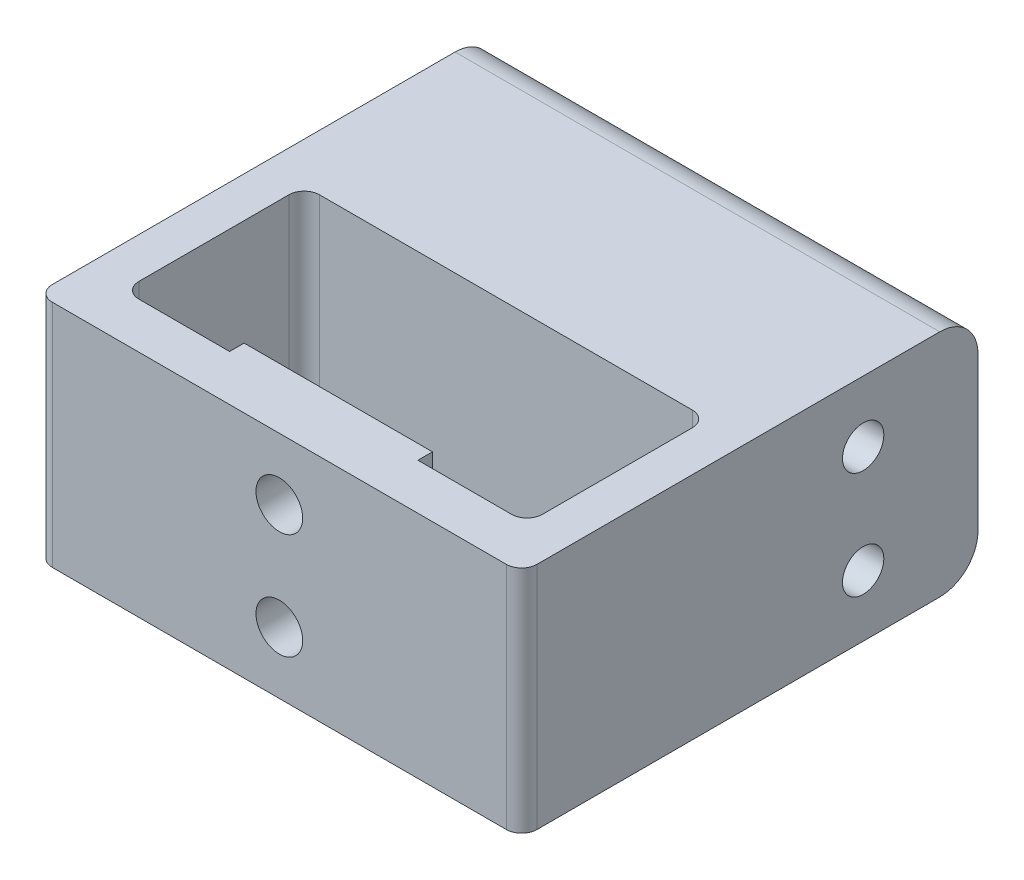
ISO-10303-21;
HEADER;
FILE_DESCRIPTION(('STEP AP214'),'2;1');
FILE_NAME('part.step','',(''),(''),'','','');
FILE_SCHEMA(('AUTOMOTIVE_DESIGN { 1 0 10303 214 1 1 1 1 }'));
ENDSEC;
DATA;
#1=APPLICATION_CONTEXT('core data for automotive mechanical design processes');
#2=APPLICATION_PROTOCOL_DEFINITION('international standard','automotive_design',2000,#1);
#3=PRODUCT_CONTEXT('',#1,'mechanical');
#4=PRODUCT('Part','Part','',(#3));
#5=PRODUCT_RELATED_PRODUCT_CATEGORY('part','',(#4));
#6=PRODUCT_DEFINITION_FORMATION('','',#4);
#7=PRODUCT_DEFINITION_CONTEXT('part definition',#1,'design');
#8=PRODUCT_DEFINITION('design','',#6,#7);
#9=PRODUCT_DEFINITION_SHAPE('','',#8);
#10=(LENGTH_UNIT() NAMED_UNIT(*) SI_UNIT(.MILLI.,.METRE.));
#11=(NAMED_UNIT(*) PLANE_ANGLE_UNIT() SI_UNIT($,.RADIAN.));
#12=(NAMED_UNIT(*) SI_UNIT($,.STERADIAN.) SOLID_ANGLE_UNIT());
#13=UNCERTAINTY_MEASURE_WITH_UNIT(LENGTH_MEASURE(1.E-05),#10,'distance_accuracy_value','');
#14=(GEOMETRIC_REPRESENTATION_CONTEXT(3) GLOBAL_UNCERTAINTY_ASSIGNED_CONTEXT((#13)) GLOBAL_UNIT_ASSIGNED_CONTEXT((#10,
#11,#12)) REPRESENTATION_CONTEXT('',''));
#15=CARTESIAN_POINT('',(0.,0.,0.));
#16=DIRECTION('',(0.,0.,1.));
#17=DIRECTION('',(1.,0.,0.));
#18=AXIS2_PLACEMENT_3D('',#15,#16,#17);
#19=CARTESIAN_POINT('',(-12.5,13.8449367088608,1.9));
#20=DIRECTION('',(1.,0.,0.));
#21=DIRECTION('',(0.,1.,0.));
#22=AXIS2_PLACEMENT_3D('',#19,#20,#21);
#23=PLANE('',#22);
#24=DIRECTION('',(0.,-1.,0.));
#25=VECTOR('',#24,1.);
#26=CARTESIAN_POINT('',(-12.5,13.8449367088608,0.));
#27=LINE('',#26,#25);
#28=CARTESIAN_POINT('',(-12.5,13.8449367088608,0.));
#29=VERTEX_POINT('',#28);
#30=CARTESIAN_POINT('',(-12.5,-16.1550632911392,0.));
#31=VERTEX_POINT('',#30);
#32=EDGE_CURVE('E222',#29,#31,#27,.T.);
#33=ORIENTED_EDGE('',*,*,#32,.T.);
#34=DIRECTION('',(0.,0.,-1.));
#35=VECTOR('',#34,1.);
#36=CARTESIAN_POINT('',(-12.5,-16.1550632911392,1.9));
#37=LINE('',#36,#35);
#38=CARTESIAN_POINT('',(-12.5,-16.1550632911392,1.9));
#39=VERTEX_POINT('',#38);
#40=EDGE_CURVE('E236',#39,#31,#37,.T.);
#41=ORIENTED_EDGE('',*,*,#40,.F.);
#42=DIRECTION('',(0.,-1.,0.));
#43=VECTOR('',#42,1.);
#44=CARTESIAN_POINT('',(-12.5,13.8449367088608,1.9));
#45=LINE('',#44,#43);
#46=CARTESIAN_POINT('',(-12.5,13.8449367088608,1.9));
#47=VERTEX_POINT('',#46);
#48=EDGE_CURVE('E212',#47,#39,#45,.T.);
#49=ORIENTED_EDGE('',*,*,#48,.F.);
#50=DIRECTION('',(0.,0.,-1.));
#51=VECTOR('',#50,1.);
#52=CARTESIAN_POINT('',(-12.5,13.8449367088608,1.9));
#53=LINE('',#52,#51);
#54=EDGE_CURVE('E206',#47,#29,#53,.T.);
#55=ORIENTED_EDGE('',*,*,#54,.T.);
#56=EDGE_LOOP('',(#33,#41,#49,#55));
#57=FACE_BOUND('',#56,.T.);
#58=ADVANCED_FACE('F39',(#57),#23,.F.);
#59=CARTESIAN_POINT('',(-12.5,-16.1550632911392,1.9));
#60=DIRECTION('',(0.,1.,0.));
#61=DIRECTION('',(0.,0.,1.));
#62=AXIS2_PLACEMENT_3D('',#59,#60,#61);
#63=PLANE('',#62);
#64=DIRECTION('',(0.,0.,-1.));
#65=VECTOR('',#64,1.);
#66=CARTESIAN_POINT('',(26.35,-16.1550632911393,7.9));
#67=LINE('',#66,#65);
#68=CARTESIAN_POINT('',(26.35,-16.1550632911393,-0.0999999999999994));
#69=VERTEX_POINT('',#68);
#70=CARTESIAN_POINT('',(26.35,-16.1550632911393,-19.7));
#71=VERTEX_POINT('',#70);
#72=EDGE_CURVE('E388',#69,#71,#67,.T.);
#73=ORIENTED_EDGE('',*,*,#72,.T.);
#74=CARTESIAN_POINT('',(24.35,-16.1550632911392,-19.7));
#75=DIRECTION('',(0.,1.,0.));
#76=DIRECTION('',(0.,0.,1.));
#77=AXIS2_PLACEMENT_3D('',#74,#75,#76);
#78=CIRCLE('',#77,2.);
#79=CARTESIAN_POINT('',(24.35,-16.1550632911393,-21.7));
#80=VERTEX_POINT('',#79);
#81=EDGE_CURVE('E316',#71,#80,#78,.T.);
#82=ORIENTED_EDGE('',*,*,#81,.T.);
#83=DIRECTION('',(-1.,0.,0.));
#84=VECTOR('',#83,1.);
#85=CARTESIAN_POINT('',(31.65,-16.1550632911393,-21.7));
#86=LINE('',#85,#84);
#87=CARTESIAN_POINT('',(-24.35,-16.1550632911393,-21.7));
#88=VERTEX_POINT('',#87);
#89=EDGE_CURVE('E380',#80,#88,#86,.T.);
#90=ORIENTED_EDGE('',*,*,#89,.T.);
#91=CARTESIAN_POINT('',(-24.35,-16.1550632911392,-19.7));
#92=DIRECTION('',(0.,1.,0.));
#93=DIRECTION('',(0.,0.,1.));
#94=AXIS2_PLACEMENT_3D('',#91,#92,#93);
#95=CIRCLE('',#94,2.);
#96=CARTESIAN_POINT('',(-26.35,-16.1550632911393,-19.7));
#97=VERTEX_POINT('',#96);
#98=EDGE_CURVE('E302',#88,#97,#95,.T.);
#99=ORIENTED_EDGE('',*,*,#98,.T.);
#100=DIRECTION('',(0.,0.,1.));
#101=VECTOR('',#100,1.);
#102=CARTESIAN_POINT('',(-26.35,-16.1550632911393,7.9));
#103=LINE('',#102,#101);
#104=CARTESIAN_POINT('',(-26.35,-16.1550632911393,-0.0999999999999994));
#105=VERTEX_POINT('',#104);
#106=EDGE_CURVE('E407',#97,#105,#103,.T.);
#107=ORIENTED_EDGE('',*,*,#106,.T.);
#108=CARTESIAN_POINT('',(-24.35,-16.1550632911392,-0.1));
#109=DIRECTION('',(0.,1.,0.));
#110=DIRECTION('',(0.,0.,1.));
#111=AXIS2_PLACEMENT_3D('',#108,#109,#110);
#112=CIRCLE('',#111,2.);
#113=CARTESIAN_POINT('',(-24.35,-16.1550632911393,1.9));
#114=VERTEX_POINT('',#113);
#115=EDGE_CURVE('E296',#105,#114,#112,.T.);
#116=ORIENTED_EDGE('',*,*,#115,.T.);
#117=DIRECTION('',(1.,0.,0.));
#118=VECTOR('',#117,1.);
#119=CARTESIAN_POINT('',(-26.35,-16.1550632911393,1.9));
#120=LINE('',#119,#118);
#121=EDGE_CURVE('E422',#114,#39,#120,.T.);
#122=ORIENTED_EDGE('',*,*,#121,.T.);
#123=ORIENTED_EDGE('',*,*,#40,.T.);
#124=DIRECTION('',(1.,0.,0.));
#125=VECTOR('',#124,1.);
#126=CARTESIAN_POINT('',(-12.5,-16.1550632911392,0.));
#127=LINE('',#126,#125);
#128=CARTESIAN_POINT('',(12.1,-16.1550632911392,0.));
#129=VERTEX_POINT('',#128);
#130=EDGE_CURVE('E226',#31,#129,#127,.T.);
#131=ORIENTED_EDGE('',*,*,#130,.T.);
#132=DIRECTION('',(0.,0.,-1.));
#133=VECTOR('',#132,1.);
#134=CARTESIAN_POINT('',(12.1,-16.1550632911392,1.9));
#135=LINE('',#134,#133);
#136=CARTESIAN_POINT('',(12.1,-16.1550632911392,1.9));
#137=VERTEX_POINT('',#136);
#138=EDGE_CURVE('E205',#137,#129,#135,.T.);
#139=ORIENTED_EDGE('',*,*,#138,.F.);
#140=CARTESIAN_POINT('',(24.35,-16.1550632911393,1.9));
#141=VERTEX_POINT('',#140);
#142=EDGE_CURVE('E210',#137,#141,#120,.T.);
#143=ORIENTED_EDGE('',*,*,#142,.T.);
#144=CARTESIAN_POINT('',(24.35,-16.1550632911392,-0.1));
#145=DIRECTION('',(0.,1.,0.));
#146=DIRECTION('',(0.,0.,1.));
#147=AXIS2_PLACEMENT_3D('',#144,#145,#146);
#148=CIRCLE('',#147,2.);
#149=EDGE_CURVE('E310',#141,#69,#148,.T.);
#150=ORIENTED_EDGE('',*,*,#149,.T.);
#151=EDGE_LOOP('',(#73,#82,#90,#99,#107,#116,#122,#123,#131,#139,#143,#150));
#152=FACE_BOUND('',#151,.T.);
#153=DIRECTION('',(0.,0.,1.));
#154=VECTOR('',#153,1.);
#155=CARTESIAN_POINT('',(-31.65,-16.1550632911393,7.9));
#156=LINE('',#155,#154);
#157=CARTESIAN_POINT('',(-31.65,-16.1550632911393,-46.7));
#158=VERTEX_POINT('',#157);
#159=CARTESIAN_POINT('',(-31.65,-16.1550632911393,5.9));
#160=VERTEX_POINT('',#159);
#161=EDGE_CURVE('E406',#158,#160,#156,.T.);
#162=ORIENTED_EDGE('',*,*,#161,.F.);
#163=DIRECTION('',(-1.,0.,0.));
#164=VECTOR('',#163,1.);
#165=CARTESIAN_POINT('',(31.65,-16.1550632911392,-46.7));
#166=LINE('',#165,#164);
#167=CARTESIAN_POINT('',(31.65,-16.1550632911393,-46.7));
#168=VERTEX_POINT('',#167);
#169=EDGE_CURVE('E65',#158,#168,#166,.F.);
#170=ORIENTED_EDGE('',*,*,#169,.T.);
#171=DIRECTION('',(0.,0.,-1.));
#172=VECTOR('',#171,1.);
#173=CARTESIAN_POINT('',(31.65,-16.1550632911393,7.9));
#174=LINE('',#173,#172);
#175=CARTESIAN_POINT('',(31.65,-16.1550632911393,5.9));
#176=VERTEX_POINT('',#175);
#177=EDGE_CURVE('E389',#176,#168,#174,.T.);
#178=ORIENTED_EDGE('',*,*,#177,.F.);
#179=CARTESIAN_POINT('',(29.65,-16.1550632911392,5.9));
#180=DIRECTION('',(0.,1.,0.));
#181=DIRECTION('',(0.,0.,1.));
#182=AXIS2_PLACEMENT_3D('',#179,#180,#181);
#183=CIRCLE('',#182,2.);
#184=CARTESIAN_POINT('',(29.65,-16.1550632911393,7.9));
#185=VERTEX_POINT('',#184);
#186=EDGE_CURVE('E257',#176,#185,#183,.F.);
#187=ORIENTED_EDGE('',*,*,#186,.T.);
#188=DIRECTION('',(1.,0.,0.));
#189=VECTOR('',#188,1.);
#190=CARTESIAN_POINT('',(-26.35,-16.1550632911393,7.9));
#191=LINE('',#190,#189);
#192=CARTESIAN_POINT('',(-29.65,-16.1550632911393,7.9));
#193=VERTEX_POINT('',#192);
#194=EDGE_CURVE('E193',#193,#185,#191,.T.);
#195=ORIENTED_EDGE('',*,*,#194,.F.);
#196=CARTESIAN_POINT('',(-29.65,-16.1550632911392,5.9));
#197=DIRECTION('',(0.,1.,0.));
#198=DIRECTION('',(0.,0.,1.));
#199=AXIS2_PLACEMENT_3D('',#196,#197,#198);
#200=CIRCLE('',#199,2.);
#201=EDGE_CURVE('E260',#193,#160,#200,.F.);
#202=ORIENTED_EDGE('',*,*,#201,.T.);
#203=EDGE_LOOP('',(#162,#170,#178,#187,#195,#202));
#204=FACE_BOUND('',#203,.T.);
#205=ADVANCED_FACE('F430',(#152,#204),#63,.F.);
#206=CARTESIAN_POINT('',(12.1,13.8449367088608,1.9));
#207=DIRECTION('',(-1.,0.,0.));
#208=DIRECTION('',(0.,-1.,0.));
#209=AXIS2_PLACEMENT_3D('',#206,#207,#208);
#210=PLANE('',#209);
#211=DIRECTION('',(0.,1.,0.));
#212=VECTOR('',#211,1.);
#213=CARTESIAN_POINT('',(12.1,13.8449367088608,0.));
#214=LINE('',#213,#212);
#215=CARTESIAN_POINT('',(12.1,13.8449367088608,0.));
#216=VERTEX_POINT('',#215);
#217=EDGE_CURVE('E203',#129,#216,#214,.T.);
#218=ORIENTED_EDGE('',*,*,#217,.T.);
#219=DIRECTION('',(0.,0.,-1.));
#220=VECTOR('',#219,1.);
#221=CARTESIAN_POINT('',(12.1,13.8449367088608,1.9));
#222=LINE('',#221,#220);
#223=CARTESIAN_POINT('',(12.1,13.8449367088607,1.9));
#224=VERTEX_POINT('',#223);
#225=EDGE_CURVE('E185',#224,#216,#222,.T.);
#226=ORIENTED_EDGE('',*,*,#225,.F.);
#227=DIRECTION('',(0.,1.,0.));
#228=VECTOR('',#227,1.);
#229=CARTESIAN_POINT('',(12.1,13.8449367088608,1.9));
#230=LINE('',#229,#228);
#231=EDGE_CURVE('E200',#137,#224,#230,.T.);
#232=ORIENTED_EDGE('',*,*,#231,.F.);
#233=ORIENTED_EDGE('',*,*,#138,.T.);
#234=EDGE_LOOP('',(#218,#226,#232,#233));
#235=FACE_BOUND('',#234,.T.);
#236=ADVANCED_FACE('F198',(#235),#210,.F.);
#237=CARTESIAN_POINT('',(-12.5,13.8449367088608,1.9));
#238=DIRECTION('',(0.,-1.,0.));
#239=DIRECTION('',(0.,0.,-1.));
#240=AXIS2_PLACEMENT_3D('',#237,#238,#239);
#241=PLANE('',#240);
#242=DIRECTION('',(-1.,0.,0.));
#243=VECTOR('',#242,1.);
#244=CARTESIAN_POINT('',(-26.35,13.8449367088607,1.9));
#245=LINE('',#244,#243);
#246=CARTESIAN_POINT('',(-24.35,13.8449367088607,1.9));
#247=VERTEX_POINT('',#246);
#248=EDGE_CURVE('E194',#47,#247,#245,.T.);
#249=ORIENTED_EDGE('',*,*,#248,.T.);
#250=CARTESIAN_POINT('',(-24.35,13.8449367088608,-0.1));
#251=DIRECTION('',(0.,-1.,0.));
#252=DIRECTION('',(0.,0.,-1.));
#253=AXIS2_PLACEMENT_3D('',#250,#251,#252);
#254=CIRCLE('',#253,2.);
#255=CARTESIAN_POINT('',(-26.35,13.8449367088607,-0.0999999999999994));
#256=VERTEX_POINT('',#255);
#257=EDGE_CURVE('E299',#247,#256,#254,.T.);
#258=ORIENTED_EDGE('',*,*,#257,.T.);
#259=DIRECTION('',(0.,0.,-1.));
#260=VECTOR('',#259,1.);
#261=CARTESIAN_POINT('',(-26.35,13.8449367088607,7.9));
#262=LINE('',#261,#260);
#263=CARTESIAN_POINT('',(-26.35,13.8449367088607,-19.7));
#264=VERTEX_POINT('',#263);
#265=EDGE_CURVE('E396',#256,#264,#262,.T.);
#266=ORIENTED_EDGE('',*,*,#265,.T.);
#267=CARTESIAN_POINT('',(-24.35,13.8449367088608,-19.7));
#268=DIRECTION('',(0.,-1.,0.));
#269=DIRECTION('',(0.,0.,-1.));
#270=AXIS2_PLACEMENT_3D('',#267,#268,#269);
#271=CIRCLE('',#270,2.);
#272=CARTESIAN_POINT('',(-24.35,13.8449367088608,-21.7));
#273=VERTEX_POINT('',#272);
#274=EDGE_CURVE('E305',#264,#273,#271,.T.);
#275=ORIENTED_EDGE('',*,*,#274,.T.);
#276=DIRECTION('',(1.,0.,0.));
#277=VECTOR('',#276,1.);
#278=CARTESIAN_POINT('',(31.65,13.8449367088608,-21.7));
#279=LINE('',#278,#277);
#280=CARTESIAN_POINT('',(24.35,13.8449367088608,-21.7));
#281=VERTEX_POINT('',#280);
#282=EDGE_CURVE('E384',#273,#281,#279,.T.);
#283=ORIENTED_EDGE('',*,*,#282,.T.);
#284=CARTESIAN_POINT('',(24.35,13.8449367088608,-19.7));
#285=DIRECTION('',(0.,-1.,0.));
#286=DIRECTION('',(0.,0.,-1.));
#287=AXIS2_PLACEMENT_3D('',#284,#285,#286);
#288=CIRCLE('',#287,2.);
#289=CARTESIAN_POINT('',(26.35,13.8449367088607,-19.7));
#290=VERTEX_POINT('',#289);
#291=EDGE_CURVE('E313',#281,#290,#288,.T.);
#292=ORIENTED_EDGE('',*,*,#291,.T.);
#293=DIRECTION('',(0.,0.,1.));
#294=VECTOR('',#293,1.);
#295=CARTESIAN_POINT('',(26.35,13.8449367088607,7.9));
#296=LINE('',#295,#294);
#297=CARTESIAN_POINT('',(26.35,13.8449367088607,-0.0999999999999994));
#298=VERTEX_POINT('',#297);
#299=EDGE_CURVE('E393',#290,#298,#296,.T.);
#300=ORIENTED_EDGE('',*,*,#299,.T.);
#301=CARTESIAN_POINT('',(24.35,13.8449367088608,-0.1));
#302=DIRECTION('',(0.,-1.,0.));
#303=DIRECTION('',(0.,0.,-1.));
#304=AXIS2_PLACEMENT_3D('',#301,#302,#303);
#305=CIRCLE('',#304,2.);
#306=CARTESIAN_POINT('',(24.35,13.8449367088607,1.9));
#307=VERTEX_POINT('',#306);
#308=EDGE_CURVE('E188',#298,#307,#305,.T.);
#309=ORIENTED_EDGE('',*,*,#308,.T.);
#310=EDGE_CURVE('E180',#307,#224,#245,.T.);
#311=ORIENTED_EDGE('',*,*,#310,.T.);
#312=ORIENTED_EDGE('',*,*,#225,.T.);
#313=DIRECTION('',(-1.,0.,0.));
#314=VECTOR('',#313,1.);
#315=CARTESIAN_POINT('',(-12.5,13.8449367088608,0.));
#316=LINE('',#315,#314);
#317=EDGE_CURVE('E219',#216,#29,#316,.T.);
#318=ORIENTED_EDGE('',*,*,#317,.T.);
#319=ORIENTED_EDGE('',*,*,#54,.F.);
#320=EDGE_LOOP('',(#249,#258,#266,#275,#283,#292,#300,#309,#311,#312,#318,#319));
#321=FACE_BOUND('',#320,.T.);
#322=DIRECTION('',(0.,0.,1.));
#323=VECTOR('',#322,1.);
#324=CARTESIAN_POINT('',(31.65,13.8449367088607,7.9));
#325=LINE('',#324,#323);
#326=CARTESIAN_POINT('',(31.65,13.8449367088607,-46.7));
#327=VERTEX_POINT('',#326);
#328=CARTESIAN_POINT('',(31.65,13.8449367088607,5.9));
#329=VERTEX_POINT('',#328);
#330=EDGE_CURVE('E392',#327,#329,#325,.T.);
#331=ORIENTED_EDGE('',*,*,#330,.F.);
#332=DIRECTION('',(1.,0.,0.));
#333=VECTOR('',#332,1.);
#334=CARTESIAN_POINT('',(-31.65,13.8449367088607,-46.7));
#335=LINE('',#334,#333);
#336=CARTESIAN_POINT('',(-31.65,13.8449367088607,-46.7));
#337=VERTEX_POINT('',#336);
#338=EDGE_CURVE('E11',#327,#337,#335,.F.);
#339=ORIENTED_EDGE('',*,*,#338,.T.);
#340=DIRECTION('',(0.,0.,-1.));
#341=VECTOR('',#340,1.);
#342=CARTESIAN_POINT('',(-31.65,13.8449367088607,7.9));
#343=LINE('',#342,#341);
#344=CARTESIAN_POINT('',(-31.65,13.8449367088607,5.9));
#345=VERTEX_POINT('',#344);
#346=EDGE_CURVE('E402',#345,#337,#343,.T.);
#347=ORIENTED_EDGE('',*,*,#346,.F.);
#348=CARTESIAN_POINT('',(-29.65,13.8449367088608,5.9));
#349=DIRECTION('',(0.,-1.,0.));
#350=DIRECTION('',(0.,0.,-1.));
#351=AXIS2_PLACEMENT_3D('',#348,#349,#350);
#352=CIRCLE('',#351,2.);
#353=CARTESIAN_POINT('',(-29.65,13.8449367088607,7.9));
#354=VERTEX_POINT('',#353);
#355=EDGE_CURVE('E248',#345,#354,#352,.F.);
#356=ORIENTED_EDGE('',*,*,#355,.T.);
#357=DIRECTION('',(-1.,0.,0.));
#358=VECTOR('',#357,1.);
#359=CARTESIAN_POINT('',(-26.35,13.8449367088607,7.9));
#360=LINE('',#359,#358);
#361=CARTESIAN_POINT('',(29.65,13.8449367088607,7.9));
#362=VERTEX_POINT('',#361);
#363=EDGE_CURVE('E227',#362,#354,#360,.T.);
#364=ORIENTED_EDGE('',*,*,#363,.F.);
#365=CARTESIAN_POINT('',(29.65,13.8449367088608,5.9));
#366=DIRECTION('',(0.,-1.,0.));
#367=DIRECTION('',(0.,0.,-1.));
#368=AXIS2_PLACEMENT_3D('',#365,#366,#367);
#369=CIRCLE('',#368,2.);
#370=EDGE_CURVE('E244',#362,#329,#369,.F.);
#371=ORIENTED_EDGE('',*,*,#370,.T.);
#372=EDGE_LOOP('',(#331,#339,#347,#356,#364,#371));
#373=FACE_BOUND('',#372,.T.);
#374=ADVANCED_FACE('F183',(#321,#373),#241,.F.);
#375=CARTESIAN_POINT('',(0.,0.,0.));
#376=DIRECTION('',(0.,0.,1.));
#377=DIRECTION('',(1.,0.,0.));
#378=AXIS2_PLACEMENT_3D('',#375,#376,#377);
#379=PLANE('',#378);
#380=CARTESIAN_POINT('',(0.,5.76993670886075,0.));
#381=DIRECTION('',(0.,0.,1.));
#382=DIRECTION('',(1.,0.,0.));
#383=AXIS2_PLACEMENT_3D('',#380,#381,#382);
#384=CIRCLE('',#383,3.05);
#385=CARTESIAN_POINT('',(-3.05,5.76993670886075,0.));
#386=VERTEX_POINT('',#385);
#387=EDGE_CURVE('E344',#386,#386,#384,.T.);
#388=ORIENTED_EDGE('',*,*,#387,.T.);
#389=EDGE_LOOP('',(#388));
#390=FACE_BOUND('',#389,.T.);
#391=CARTESIAN_POINT('',(0.,-8.08006329113925,0.));
#392=DIRECTION('',(0.,0.,1.));
#393=DIRECTION('',(1.,0.,0.));
#394=AXIS2_PLACEMENT_3D('',#391,#392,#393);
#395=CIRCLE('',#394,3.05);
#396=CARTESIAN_POINT('',(-3.05,-8.08006329113925,0.));
#397=VERTEX_POINT('',#396);
#398=EDGE_CURVE('E357',#397,#397,#395,.T.);
#399=ORIENTED_EDGE('',*,*,#398,.T.);
#400=EDGE_LOOP('',(#399));
#401=FACE_BOUND('',#400,.T.);
#402=ORIENTED_EDGE('',*,*,#32,.F.);
#403=ORIENTED_EDGE('',*,*,#317,.F.);
#404=ORIENTED_EDGE('',*,*,#217,.F.);
#405=ORIENTED_EDGE('',*,*,#130,.F.);
#406=EDGE_LOOP('',(#402,#403,#404,#405));
#407=FACE_BOUND('',#406,.T.);
#408=ADVANCED_FACE('F468',(#390,#401,#407),#379,.F.);
#409=CARTESIAN_POINT('',(0.,0.,1.9));
#410=DIRECTION('',(0.,0.,1.));
#411=DIRECTION('',(1.,0.,0.));
#412=AXIS2_PLACEMENT_3D('',#409,#410,#411);
#413=PLANE('',#412);
#414=ORIENTED_EDGE('',*,*,#121,.F.);
#415=DIRECTION('',(0.,-1.,0.));
#416=VECTOR('',#415,1.);
#417=CARTESIAN_POINT('',(-24.35,0.,1.9));
#418=LINE('',#417,#416);
#419=EDGE_CURVE('E275',#114,#247,#418,.F.);
#420=ORIENTED_EDGE('',*,*,#419,.T.);
#421=ORIENTED_EDGE('',*,*,#248,.F.);
#422=ORIENTED_EDGE('',*,*,#48,.T.);
#423=EDGE_LOOP('',(#414,#420,#421,#422));
#424=FACE_BOUND('',#423,.T.);
#425=ADVANCED_FACE('F462',(#424),#413,.F.);
#426=ORIENTED_EDGE('',*,*,#310,.F.);
#427=DIRECTION('',(0.,1.,0.));
#428=VECTOR('',#427,1.);
#429=CARTESIAN_POINT('',(24.35,-16.1550632911393,1.9));
#430=LINE('',#429,#428);
#431=EDGE_CURVE('E293',#307,#141,#430,.F.);
#432=ORIENTED_EDGE('',*,*,#431,.T.);
#433=ORIENTED_EDGE('',*,*,#142,.F.);
#434=ORIENTED_EDGE('',*,*,#231,.T.);
#435=EDGE_LOOP('',(#426,#432,#433,#434));
#436=FACE_BOUND('',#435,.T.);
#437=ADVANCED_FACE('F208',(#436),#413,.F.);
#438=CARTESIAN_POINT('',(0.,0.,7.9));
#439=DIRECTION('',(0.,0.,1.));
#440=DIRECTION('',(1.,0.,0.));
#441=AXIS2_PLACEMENT_3D('',#438,#439,#440);
#442=PLANE('',#441);
#443=CARTESIAN_POINT('',(0.,5.76993670886075,7.9));
#444=DIRECTION('',(0.,0.,1.));
#445=DIRECTION('',(1.,0.,0.));
#446=AXIS2_PLACEMENT_3D('',#443,#444,#445);
#447=CIRCLE('',#446,3.05);
#448=CARTESIAN_POINT('',(-3.05,5.76993670886075,7.9));
#449=VERTEX_POINT('',#448);
#450=EDGE_CURVE('E343',#449,#449,#447,.F.);
#451=ORIENTED_EDGE('',*,*,#450,.T.);
#452=EDGE_LOOP('',(#451));
#453=FACE_BOUND('',#452,.T.);
#454=CARTESIAN_POINT('',(0.,-8.08006329113925,7.9));
#455=DIRECTION('',(0.,0.,1.));
#456=DIRECTION('',(1.,0.,0.));
#457=AXIS2_PLACEMENT_3D('',#454,#455,#456);
#458=CIRCLE('',#457,3.05);
#459=CARTESIAN_POINT('',(-3.05,-8.08006329113925,7.9));
#460=VERTEX_POINT('',#459);
#461=EDGE_CURVE('E339',#460,#460,#458,.F.);
#462=ORIENTED_EDGE('',*,*,#461,.T.);
#463=EDGE_LOOP('',(#462));
#464=FACE_BOUND('',#463,.T.);
#465=ORIENTED_EDGE('',*,*,#363,.T.);
#466=DIRECTION('',(0.,1.,0.));
#467=VECTOR('',#466,1.);
#468=CARTESIAN_POINT('',(-29.65,-16.1550632911393,7.9));
#469=LINE('',#468,#467);
#470=EDGE_CURVE('E254',#354,#193,#469,.F.);
#471=ORIENTED_EDGE('',*,*,#470,.T.);
#472=ORIENTED_EDGE('',*,*,#194,.T.);
#473=DIRECTION('',(0.,-1.,0.));
#474=VECTOR('',#473,1.);
#475=CARTESIAN_POINT('',(29.65,0.,7.9));
#476=LINE('',#475,#474);
#477=EDGE_CURVE('E251',#185,#362,#476,.F.);
#478=ORIENTED_EDGE('',*,*,#477,.T.);
#479=EDGE_LOOP('',(#465,#471,#472,#478));
#480=FACE_BOUND('',#479,.T.);
#481=ADVANCED_FACE('F530',(#453,#464,#480),#442,.T.);
#482=CARTESIAN_POINT('',(-31.65,0.,0.));
#483=DIRECTION('',(1.,0.,0.));
#484=DIRECTION('',(0.,1.,0.));
#485=AXIS2_PLACEMENT_3D('',#482,#483,#484);
#486=PLANE('',#485);
#487=CARTESIAN_POINT('',(-31.65,5.84493670886075,-36.7));
#488=DIRECTION('',(-1.,0.,0.));
#489=DIRECTION('',(0.,-1.,0.));
#490=AXIS2_PLACEMENT_3D('',#487,#488,#489);
#491=CIRCLE('',#490,2.70000000000001);
#492=CARTESIAN_POINT('',(-31.65,3.14493670886074,-36.7));
#493=VERTEX_POINT('',#492);
#494=EDGE_CURVE('E351',#493,#493,#491,.T.);
#495=ORIENTED_EDGE('',*,*,#494,.F.);
#496=EDGE_LOOP('',(#495));
#497=FACE_BOUND('',#496,.T.);
#498=CARTESIAN_POINT('',(-31.65,-8.15506329113927,-36.7));
#499=DIRECTION('',(-1.,0.,0.));
#500=DIRECTION('',(0.,-1.,0.));
#501=AXIS2_PLACEMENT_3D('',#498,#499,#500);
#502=CIRCLE('',#501,2.70000000000001);
#503=CARTESIAN_POINT('',(-31.65,-10.8550632911393,-36.7));
#504=VERTEX_POINT('',#503);
#505=EDGE_CURVE('E359',#504,#504,#502,.T.);
#506=ORIENTED_EDGE('',*,*,#505,.F.);
#507=EDGE_LOOP('',(#506));
#508=FACE_BOUND('',#507,.T.);
#509=DIRECTION('',(0.,1.,0.));
#510=VECTOR('',#509,1.);
#511=CARTESIAN_POINT('',(-31.65,13.8449367088607,-51.7));
#512=LINE('',#511,#510);
#513=CARTESIAN_POINT('',(-31.65,-11.1550632911393,-51.7));
#514=VERTEX_POINT('',#513);
#515=CARTESIAN_POINT('',(-31.65,8.84493670886075,-51.7));
#516=VERTEX_POINT('',#515);
#517=EDGE_CURVE('E376',#514,#516,#512,.T.);
#518=ORIENTED_EDGE('',*,*,#517,.F.);
#519=CARTESIAN_POINT('',(-31.65,-11.1550632911393,-46.7));
#520=DIRECTION('',(1.,0.,0.));
#521=DIRECTION('',(0.,1.,0.));
#522=AXIS2_PLACEMENT_3D('',#519,#520,#521);
#523=CIRCLE('',#522,5.);
#524=EDGE_CURVE('E330',#514,#158,#523,.F.);
#525=ORIENTED_EDGE('',*,*,#524,.T.);
#526=ORIENTED_EDGE('',*,*,#161,.T.);
#527=DIRECTION('',(0.,1.,0.));
#528=VECTOR('',#527,1.);
#529=CARTESIAN_POINT('',(-31.65,13.8449367088607,5.9));
#530=LINE('',#529,#528);
#531=EDGE_CURVE('E240',#160,#345,#530,.T.);
#532=ORIENTED_EDGE('',*,*,#531,.T.);
#533=ORIENTED_EDGE('',*,*,#346,.T.);
#534=CARTESIAN_POINT('',(-31.65,8.84493670886075,-46.7));
#535=DIRECTION('',(1.,0.,0.));
#536=DIRECTION('',(0.,1.,0.));
#537=AXIS2_PLACEMENT_3D('',#534,#535,#536);
#538=CIRCLE('',#537,5.);
#539=EDGE_CURVE('E327',#337,#516,#538,.F.);
#540=ORIENTED_EDGE('',*,*,#539,.T.);
#541=EDGE_LOOP('',(#518,#525,#526,#532,#533,#540));
#542=FACE_BOUND('',#541,.T.);
#543=ADVANCED_FACE('F523',(#497,#508,#542),#486,.F.);
#544=CARTESIAN_POINT('',(-26.35,0.,0.));
#545=DIRECTION('',(1.,0.,0.));
#546=DIRECTION('',(0.,1.,0.));
#547=AXIS2_PLACEMENT_3D('',#544,#545,#546);
#548=PLANE('',#547);
#549=ORIENTED_EDGE('',*,*,#265,.F.);
#550=DIRECTION('',(0.,-1.,0.));
#551=VECTOR('',#550,1.);
#552=CARTESIAN_POINT('',(-26.35,0.,-0.1));
#553=LINE('',#552,#551);
#554=EDGE_CURVE('E271',#256,#105,#553,.T.);
#555=ORIENTED_EDGE('',*,*,#554,.T.);
#556=ORIENTED_EDGE('',*,*,#106,.F.);
#557=DIRECTION('',(0.,-1.,0.));
#558=VECTOR('',#557,1.);
#559=CARTESIAN_POINT('',(-26.35,0.,-19.7));
#560=LINE('',#559,#558);
#561=EDGE_CURVE('E268',#97,#264,#560,.F.);
#562=ORIENTED_EDGE('',*,*,#561,.T.);
#563=EDGE_LOOP('',(#549,#555,#556,#562));
#564=FACE_BOUND('',#563,.T.);
#565=ADVANCED_FACE('F453',(#564),#548,.T.);
#566=CARTESIAN_POINT('',(26.35,0.,0.));
#567=DIRECTION('',(1.,0.,0.));
#568=DIRECTION('',(0.,1.,0.));
#569=AXIS2_PLACEMENT_3D('',#566,#567,#568);
#570=PLANE('',#569);
#571=ORIENTED_EDGE('',*,*,#72,.F.);
#572=DIRECTION('',(0.,1.,0.));
#573=VECTOR('',#572,1.);
#574=CARTESIAN_POINT('',(26.35,13.8449367088607,-0.1));
#575=LINE('',#574,#573);
#576=EDGE_CURVE('E289',#69,#298,#575,.T.);
#577=ORIENTED_EDGE('',*,*,#576,.T.);
#578=ORIENTED_EDGE('',*,*,#299,.F.);
#579=DIRECTION('',(0.,1.,0.));
#580=VECTOR('',#579,1.);
#581=CARTESIAN_POINT('',(26.35,-16.1550632911393,-19.7));
#582=LINE('',#581,#580);
#583=EDGE_CURVE('E286',#290,#71,#582,.F.);
#584=ORIENTED_EDGE('',*,*,#583,.T.);
#585=EDGE_LOOP('',(#571,#577,#578,#584));
#586=FACE_BOUND('',#585,.T.);
#587=ADVANCED_FACE('F437',(#586),#570,.F.);
#588=CARTESIAN_POINT('',(31.65,0.,0.));
#589=DIRECTION('',(1.,0.,0.));
#590=DIRECTION('',(0.,1.,0.));
#591=AXIS2_PLACEMENT_3D('',#588,#589,#590);
#592=PLANE('',#591);
#593=CARTESIAN_POINT('',(31.65,5.84493670886075,-36.7));
#594=DIRECTION('',(1.,0.,0.));
#595=DIRECTION('',(0.,1.,0.));
#596=AXIS2_PLACEMENT_3D('',#593,#594,#595);
#597=CIRCLE('',#596,2.70000000000001);
#598=CARTESIAN_POINT('',(31.65,8.54493670886077,-36.7));
#599=VERTEX_POINT('',#598);
#600=EDGE_CURVE('E43',#599,#599,#597,.T.);
#601=ORIENTED_EDGE('',*,*,#600,.F.);
#602=EDGE_LOOP('',(#601));
#603=FACE_BOUND('',#602,.T.);
#604=CARTESIAN_POINT('',(31.65,-8.15506329113926,-36.7));
#605=DIRECTION('',(1.,0.,0.));
#606=DIRECTION('',(0.,1.,0.));
#607=AXIS2_PLACEMENT_3D('',#604,#605,#606);
#608=CIRCLE('',#607,2.70000000000001);
#609=CARTESIAN_POINT('',(31.65,-5.45506329113925,-36.7));
#610=VERTEX_POINT('',#609);
#611=EDGE_CURVE('E348',#610,#610,#608,.T.);
#612=ORIENTED_EDGE('',*,*,#611,.F.);
#613=EDGE_LOOP('',(#612));
#614=FACE_BOUND('',#613,.T.);
#615=ORIENTED_EDGE('',*,*,#177,.T.);
#616=CARTESIAN_POINT('',(31.65,-11.1550632911393,-46.7));
#617=DIRECTION('',(1.,0.,0.));
#618=DIRECTION('',(0.,1.,0.));
#619=AXIS2_PLACEMENT_3D('',#616,#617,#618);
#620=CIRCLE('',#619,5.);
#621=CARTESIAN_POINT('',(31.65,-11.1550632911393,-51.7));
#622=VERTEX_POINT('',#621);
#623=EDGE_CURVE('E49',#168,#622,#620,.T.);
#624=ORIENTED_EDGE('',*,*,#623,.T.);
#625=DIRECTION('',(0.,-1.,0.));
#626=VECTOR('',#625,1.);
#627=CARTESIAN_POINT('',(31.65,13.8449367088607,-51.7));
#628=LINE('',#627,#626);
#629=CARTESIAN_POINT('',(31.65,8.84493670886075,-51.7));
#630=VERTEX_POINT('',#629);
#631=EDGE_CURVE('E347',#630,#622,#628,.T.);
#632=ORIENTED_EDGE('',*,*,#631,.F.);
#633=CARTESIAN_POINT('',(31.65,8.84493670886075,-46.7));
#634=DIRECTION('',(1.,0.,0.));
#635=DIRECTION('',(0.,1.,0.));
#636=AXIS2_PLACEMENT_3D('',#633,#634,#635);
#637=CIRCLE('',#636,5.);
#638=EDGE_CURVE('E57',#630,#327,#637,.T.);
#639=ORIENTED_EDGE('',*,*,#638,.T.);
#640=ORIENTED_EDGE('',*,*,#330,.T.);
#641=DIRECTION('',(0.,-1.,0.));
#642=VECTOR('',#641,1.);
#643=CARTESIAN_POINT('',(31.65,0.,5.9));
#644=LINE('',#643,#642);
#645=EDGE_CURVE('E264',#329,#176,#644,.T.);
#646=ORIENTED_EDGE('',*,*,#645,.T.);
#647=EDGE_LOOP('',(#615,#624,#632,#639,#640,#646));
#648=FACE_BOUND('',#647,.T.);
#649=ADVANCED_FACE('F516',(#603,#614,#648),#592,.T.);
#650=CARTESIAN_POINT('',(0.,0.,-21.7));
#651=DIRECTION('',(0.,0.,-1.));
#652=DIRECTION('',(-1.,0.,0.));
#653=AXIS2_PLACEMENT_3D('',#650,#651,#652);
#654=PLANE('',#653);
#655=ORIENTED_EDGE('',*,*,#282,.F.);
#656=DIRECTION('',(0.,-1.,0.));
#657=VECTOR('',#656,1.);
#658=CARTESIAN_POINT('',(-24.35,0.,-21.7));
#659=LINE('',#658,#657);
#660=EDGE_CURVE('E282',#273,#88,#659,.T.);
#661=ORIENTED_EDGE('',*,*,#660,.T.);
#662=ORIENTED_EDGE('',*,*,#89,.F.);
#663=DIRECTION('',(0.,1.,0.));
#664=VECTOR('',#663,1.);
#665=CARTESIAN_POINT('',(24.35,13.8449367088608,-21.7));
#666=LINE('',#665,#664);
#667=EDGE_CURVE('E278',#80,#281,#666,.T.);
#668=ORIENTED_EDGE('',*,*,#667,.T.);
#669=EDGE_LOOP('',(#655,#661,#662,#668));
#670=FACE_BOUND('',#669,.T.);
#671=ADVANCED_FACE('F446',(#670),#654,.F.);
#672=CARTESIAN_POINT('',(-29.65,0.,5.9));
#673=DIRECTION('',(0.,-1.,0.));
#674=DIRECTION('',(1.,0.,0.));
#675=AXIS2_PLACEMENT_3D('',#672,#673,#674);
#676=CYLINDRICAL_SURFACE('',#675,2.);
#677=ORIENTED_EDGE('',*,*,#201,.F.);
#678=ORIENTED_EDGE('',*,*,#470,.F.);
#679=ORIENTED_EDGE('',*,*,#355,.F.);
#680=ORIENTED_EDGE('',*,*,#531,.F.);
#681=EDGE_LOOP('',(#677,#678,#679,#680));
#682=FACE_BOUND('',#681,.T.);
#683=ADVANCED_FACE('F487',(#682),#676,.T.);
#684=CARTESIAN_POINT('',(29.65,0.,5.9));
#685=DIRECTION('',(0.,-1.,0.));
#686=DIRECTION('',(1.,0.,0.));
#687=AXIS2_PLACEMENT_3D('',#684,#685,#686);
#688=CYLINDRICAL_SURFACE('',#687,2.);
#689=ORIENTED_EDGE('',*,*,#370,.F.);
#690=ORIENTED_EDGE('',*,*,#477,.F.);
#691=ORIENTED_EDGE('',*,*,#186,.F.);
#692=ORIENTED_EDGE('',*,*,#645,.F.);
#693=EDGE_LOOP('',(#689,#690,#691,#692));
#694=FACE_BOUND('',#693,.T.);
#695=ADVANCED_FACE('F490',(#694),#688,.T.);
#696=CARTESIAN_POINT('',(-24.35,0.,-0.1));
#697=DIRECTION('',(0.,-1.,0.));
#698=DIRECTION('',(1.,0.,0.));
#699=AXIS2_PLACEMENT_3D('',#696,#697,#698);
#700=CYLINDRICAL_SURFACE('',#699,2.);
#701=ORIENTED_EDGE('',*,*,#257,.F.);
#702=ORIENTED_EDGE('',*,*,#419,.F.);
#703=ORIENTED_EDGE('',*,*,#115,.F.);
#704=ORIENTED_EDGE('',*,*,#554,.F.);
#705=EDGE_LOOP('',(#701,#702,#703,#704));
#706=FACE_BOUND('',#705,.T.);
#707=ADVANCED_FACE('F459',(#706),#700,.F.);
#708=CARTESIAN_POINT('',(-24.35,0.,-19.7));
#709=DIRECTION('',(0.,-1.,0.));
#710=DIRECTION('',(1.,0.,0.));
#711=AXIS2_PLACEMENT_3D('',#708,#709,#710);
#712=CYLINDRICAL_SURFACE('',#711,2.);
#713=ORIENTED_EDGE('',*,*,#274,.F.);
#714=ORIENTED_EDGE('',*,*,#561,.F.);
#715=ORIENTED_EDGE('',*,*,#98,.F.);
#716=ORIENTED_EDGE('',*,*,#660,.F.);
#717=EDGE_LOOP('',(#713,#714,#715,#716));
#718=FACE_BOUND('',#717,.T.);
#719=ADVANCED_FACE('F456',(#718),#712,.F.);
#720=CARTESIAN_POINT('',(24.35,0.,-0.1));
#721=DIRECTION('',(0.,-1.,0.));
#722=DIRECTION('',(1.,0.,0.));
#723=AXIS2_PLACEMENT_3D('',#720,#721,#722);
#724=CYLINDRICAL_SURFACE('',#723,2.);
#725=ORIENTED_EDGE('',*,*,#149,.F.);
#726=ORIENTED_EDGE('',*,*,#431,.F.);
#727=ORIENTED_EDGE('',*,*,#308,.F.);
#728=ORIENTED_EDGE('',*,*,#576,.F.);
#729=EDGE_LOOP('',(#725,#726,#727,#728));
#730=FACE_BOUND('',#729,.T.);
#731=ADVANCED_FACE('F434',(#730),#724,.F.);
#732=CARTESIAN_POINT('',(24.35,0.,-19.7));
#733=DIRECTION('',(0.,-1.,0.));
#734=DIRECTION('',(1.,0.,0.));
#735=AXIS2_PLACEMENT_3D('',#732,#733,#734);
#736=CYLINDRICAL_SURFACE('',#735,2.);
#737=ORIENTED_EDGE('',*,*,#81,.F.);
#738=ORIENTED_EDGE('',*,*,#583,.F.);
#739=ORIENTED_EDGE('',*,*,#291,.F.);
#740=ORIENTED_EDGE('',*,*,#667,.F.);
#741=EDGE_LOOP('',(#737,#738,#739,#740));
#742=FACE_BOUND('',#741,.T.);
#743=ADVANCED_FACE('F443',(#742),#736,.F.);
#744=CARTESIAN_POINT('',(0.,0.,-51.7));
#745=DIRECTION('',(0.,0.,-1.));
#746=DIRECTION('',(-1.,0.,0.));
#747=AXIS2_PLACEMENT_3D('',#744,#745,#746);
#748=PLANE('',#747);
#749=ORIENTED_EDGE('',*,*,#631,.T.);
#750=DIRECTION('',(-1.,0.,0.));
#751=VECTOR('',#750,1.);
#752=CARTESIAN_POINT('',(-31.65,-11.1550632911393,-51.7));
#753=LINE('',#752,#751);
#754=EDGE_CURVE('E323',#622,#514,#753,.T.);
#755=ORIENTED_EDGE('',*,*,#754,.T.);
#756=ORIENTED_EDGE('',*,*,#517,.T.);
#757=DIRECTION('',(1.,0.,0.));
#758=VECTOR('',#757,1.);
#759=CARTESIAN_POINT('',(31.65,8.84493670886075,-51.7));
#760=LINE('',#759,#758);
#761=EDGE_CURVE('E319',#516,#630,#760,.T.);
#762=ORIENTED_EDGE('',*,*,#761,.T.);
#763=EDGE_LOOP('',(#749,#755,#756,#762));
#764=FACE_BOUND('',#763,.T.);
#765=ADVANCED_FACE('F502',(#764),#748,.T.);
#766=CARTESIAN_POINT('',(0.,-11.1550632911393,-46.7));
#767=DIRECTION('',(1.,0.,0.));
#768=DIRECTION('',(0.,0.,-1.));
#769=AXIS2_PLACEMENT_3D('',#766,#767,#768);
#770=CYLINDRICAL_SURFACE('',#769,5.);
#771=ORIENTED_EDGE('',*,*,#623,.F.);
#772=ORIENTED_EDGE('',*,*,#169,.F.);
#773=ORIENTED_EDGE('',*,*,#524,.F.);
#774=ORIENTED_EDGE('',*,*,#754,.F.);
#775=EDGE_LOOP('',(#771,#772,#773,#774));
#776=FACE_BOUND('',#775,.T.);
#777=ADVANCED_FACE('F503',(#776),#770,.T.);
#778=CARTESIAN_POINT('',(0.,8.84493670886075,-46.7));
#779=DIRECTION('',(-1.,0.,0.));
#780=DIRECTION('',(0.,0.,1.));
#781=AXIS2_PLACEMENT_3D('',#778,#779,#780);
#782=CYLINDRICAL_SURFACE('',#781,5.);
#783=ORIENTED_EDGE('',*,*,#539,.F.);
#784=ORIENTED_EDGE('',*,*,#338,.F.);
#785=ORIENTED_EDGE('',*,*,#638,.F.);
#786=ORIENTED_EDGE('',*,*,#761,.F.);
#787=EDGE_LOOP('',(#783,#784,#785,#786));
#788=FACE_BOUND('',#787,.T.);
#789=ADVANCED_FACE('F41',(#788),#782,.T.);
#790=CARTESIAN_POINT('',(0.,-8.08006329113925,26.));
#791=DIRECTION('',(0.,0.,-1.));
#792=DIRECTION('',(-1.,0.,0.));
#793=AXIS2_PLACEMENT_3D('',#790,#791,#792);
#794=CYLINDRICAL_SURFACE('',#793,3.05);
#795=CARTESIAN_POINT('',(-3.05,-8.08006329113925,7.9));
#796=CARTESIAN_POINT('',(-3.05,-8.08006329113925,7.81770833333333));
#797=CARTESIAN_POINT('',(-3.05,-8.08006329113925,7.73541666666667));
#798=CARTESIAN_POINT('',(-3.05,-8.08006329113925,7.57083333333333));
#799=CARTESIAN_POINT('',(-3.05,-8.08006329113925,7.48854166666667));
#800=CARTESIAN_POINT('',(-3.05,-8.08006329113925,7.32395833333333));
#801=CARTESIAN_POINT('',(-3.05,-8.08006329113925,7.24166666666667));
#802=CARTESIAN_POINT('',(-3.05,-8.08006329113925,7.07708333333333));
#803=CARTESIAN_POINT('',(-3.05,-8.08006329113925,6.99479166666667));
#804=CARTESIAN_POINT('',(-3.05,-8.08006329113925,6.83020833333333));
#805=CARTESIAN_POINT('',(-3.05,-8.08006329113925,6.74791666666667));
#806=CARTESIAN_POINT('',(-3.05,-8.08006329113925,6.58333333333333));
#807=CARTESIAN_POINT('',(-3.05,-8.08006329113925,6.50104166666667));
#808=CARTESIAN_POINT('',(-3.05,-8.08006329113925,6.33645833333333));
#809=CARTESIAN_POINT('',(-3.05,-8.08006329113925,6.25416666666667));
#810=CARTESIAN_POINT('',(-3.05,-8.08006329113925,6.08958333333333));
#811=CARTESIAN_POINT('',(-3.05,-8.08006329113925,6.00729166666667));
#812=CARTESIAN_POINT('',(-3.05,-8.08006329113925,5.84270833333333));
#813=CARTESIAN_POINT('',(-3.05,-8.08006329113925,5.76041666666667));
#814=CARTESIAN_POINT('',(-3.05,-8.08006329113925,5.59583333333333));
#815=CARTESIAN_POINT('',(-3.05,-8.08006329113925,5.51354166666667));
#816=CARTESIAN_POINT('',(-3.05,-8.08006329113925,5.34895833333333));
#817=CARTESIAN_POINT('',(-3.05,-8.08006329113925,5.26666666666666));
#818=CARTESIAN_POINT('',(-3.05,-8.08006329113925,5.10208333333333));
#819=CARTESIAN_POINT('',(-3.05,-8.08006329113925,5.01979166666667));
#820=CARTESIAN_POINT('',(-3.05,-8.08006329113925,4.85520833333333));
#821=CARTESIAN_POINT('',(-3.05,-8.08006329113925,4.77291666666667));
#822=CARTESIAN_POINT('',(-3.05,-8.08006329113925,4.60833333333333));
#823=CARTESIAN_POINT('',(-3.05,-8.08006329113925,4.52604166666667));
#824=CARTESIAN_POINT('',(-3.05,-8.08006329113925,4.36145833333333));
#825=CARTESIAN_POINT('',(-3.05,-8.08006329113925,4.27916666666667));
#826=CARTESIAN_POINT('',(-3.05,-8.08006329113925,4.11458333333333));
#827=CARTESIAN_POINT('',(-3.05,-8.08006329113925,4.03229166666667));
#828=CARTESIAN_POINT('',(-3.05,-8.08006329113925,3.86770833333333));
#829=CARTESIAN_POINT('',(-3.05,-8.08006329113925,3.78541666666666));
#830=CARTESIAN_POINT('',(-3.05,-8.08006329113925,3.62083333333333));
#831=CARTESIAN_POINT('',(-3.05,-8.08006329113925,3.53854166666666));
#832=CARTESIAN_POINT('',(-3.05,-8.08006329113925,3.37395833333333));
#833=CARTESIAN_POINT('',(-3.05,-8.08006329113925,3.29166666666666));
#834=CARTESIAN_POINT('',(-3.05,-8.08006329113925,3.12708333333333));
#835=CARTESIAN_POINT('',(-3.05,-8.08006329113925,3.04479166666666));
#836=CARTESIAN_POINT('',(-3.05,-8.08006329113925,2.88020833333333));
#837=CARTESIAN_POINT('',(-3.05,-8.08006329113925,2.79791666666666));
#838=CARTESIAN_POINT('',(-3.05,-8.08006329113925,2.63333333333333));
#839=CARTESIAN_POINT('',(-3.05,-8.08006329113925,2.55104166666666));
#840=CARTESIAN_POINT('',(-3.05,-8.08006329113925,2.38645833333333));
#841=CARTESIAN_POINT('',(-3.05,-8.08006329113925,2.30416666666666));
#842=CARTESIAN_POINT('',(-3.05,-8.08006329113925,2.13958333333333));
#843=CARTESIAN_POINT('',(-3.05,-8.08006329113925,2.05729166666666));
#844=CARTESIAN_POINT('',(-3.05,-8.08006329113925,1.89270833333333));
#845=CARTESIAN_POINT('',(-3.05,-8.08006329113925,1.81041666666666));
#846=CARTESIAN_POINT('',(-3.05,-8.08006329113925,1.64583333333333));
#847=CARTESIAN_POINT('',(-3.05,-8.08006329113925,1.56354166666666));
#848=CARTESIAN_POINT('',(-3.05,-8.08006329113925,1.39895833333333));
#849=CARTESIAN_POINT('',(-3.05,-8.08006329113925,1.31666666666667));
#850=CARTESIAN_POINT('',(-3.05,-8.08006329113925,1.15208333333333));
#851=CARTESIAN_POINT('',(-3.05,-8.08006329113925,1.06979166666667));
#852=CARTESIAN_POINT('',(-3.05,-8.08006329113925,0.905208333333332));
#853=CARTESIAN_POINT('',(-3.05,-8.08006329113925,0.822916666666665));
#854=CARTESIAN_POINT('',(-3.05,-8.08006329113925,0.658333333333331));
#855=CARTESIAN_POINT('',(-3.05,-8.08006329113925,0.576041666666664));
#856=CARTESIAN_POINT('',(-3.05,-8.08006329113925,0.411458333333331));
#857=CARTESIAN_POINT('',(-3.05,-8.08006329113925,0.329166666666664));
#858=CARTESIAN_POINT('',(-3.05,-8.08006329113925,0.16458333333333));
#859=CARTESIAN_POINT('',(-3.05,-8.08006329113925,0.0822916666666633));
#860=CARTESIAN_POINT('',(-3.05,-8.08006329113925,0.));
#861=B_SPLINE_CURVE_WITH_KNOTS('',3,(#795,#796,#797,#798,#799,#800,#801,#802,#803,#804,#805,
#806,#807,#808,#809,#810,#811,#812,#813,#814,#815,#816,#817,#818,#819,#820,#821,#822,#823,#824,
#825,#826,#827,#828,#829,#830,#831,#832,#833,#834,#835,#836,#837,#838,#839,#840,#841,#842,#843,
#844,#845,#846,#847,#848,#849,#850,#851,#852,#853,#854,#855,#856,#857,#858,#859,#860),
.UNSPECIFIED.,.F.,.F.,(4,2,2,2,2,2,2,2,2,2,2,2,2,2,2,2,2,2,2,2,2,2,2,2,2,2,2,2,2,2,2,2,4),(0.,
0.246875000000001,0.493750000000001,0.740625000000002,0.987500000000002,1.234375,1.48125,
1.728125,1.975,2.221875,2.46875,2.715625,2.9625,3.209375,3.45625,3.703125,3.95,4.196875,4.44375,
4.690625,4.9375,5.184375,5.43125,5.678125,5.925,6.171875,6.41875,6.665625,6.9125,7.159375,
7.40625,7.653125,7.9),.UNSPECIFIED.);
#862=EDGE_CURVE('BSEAM510',#460,#397,#861,.T.);
#863=ORIENTED_EDGE('',*,*,#461,.F.);
#864=ORIENTED_EDGE('',*,*,#398,.F.);
#865=ORIENTED_EDGE('',*,*,#862,.T.);
#866=ORIENTED_EDGE('',*,*,#862,.F.);
#867=EDGE_LOOP('',(#863,#865,#864,#866));
#868=FACE_BOUND('',#867,.T.);
#869=ADVANCED_FACE('F510',(#868),#794,.F.);
#870=CARTESIAN_POINT('',(0.,5.76993670886075,26.));
#871=DIRECTION('',(0.,0.,-1.));
#872=DIRECTION('',(-1.,0.,0.));
#873=AXIS2_PLACEMENT_3D('',#870,#871,#872);
#874=CYLINDRICAL_SURFACE('',#873,3.05);
#875=CARTESIAN_POINT('',(-3.05,5.76993670886075,7.9));
#876=CARTESIAN_POINT('',(-3.05,5.76993670886075,7.81770833333333));
#877=CARTESIAN_POINT('',(-3.05,5.76993670886075,7.73541666666667));
#878=CARTESIAN_POINT('',(-3.05,5.76993670886075,7.57083333333333));
#879=CARTESIAN_POINT('',(-3.05,5.76993670886075,7.48854166666667));
#880=CARTESIAN_POINT('',(-3.05,5.76993670886075,7.32395833333333));
#881=CARTESIAN_POINT('',(-3.05,5.76993670886075,7.24166666666667));
#882=CARTESIAN_POINT('',(-3.05,5.76993670886075,7.07708333333333));
#883=CARTESIAN_POINT('',(-3.05,5.76993670886075,6.99479166666667));
#884=CARTESIAN_POINT('',(-3.05,5.76993670886075,6.83020833333333));
#885=CARTESIAN_POINT('',(-3.05,5.76993670886075,6.74791666666667));
#886=CARTESIAN_POINT('',(-3.05,5.76993670886075,6.58333333333333));
#887=CARTESIAN_POINT('',(-3.05,5.76993670886075,6.50104166666667));
#888=CARTESIAN_POINT('',(-3.05,5.76993670886075,6.33645833333333));
#889=CARTESIAN_POINT('',(-3.05,5.76993670886075,6.25416666666667));
#890=CARTESIAN_POINT('',(-3.05,5.76993670886075,6.08958333333333));
#891=CARTESIAN_POINT('',(-3.05,5.76993670886075,6.00729166666667));
#892=CARTESIAN_POINT('',(-3.05,5.76993670886075,5.84270833333333));
#893=CARTESIAN_POINT('',(-3.05,5.76993670886075,5.76041666666667));
#894=CARTESIAN_POINT('',(-3.05,5.76993670886075,5.59583333333333));
#895=CARTESIAN_POINT('',(-3.05,5.76993670886075,5.51354166666667));
#896=CARTESIAN_POINT('',(-3.05,5.76993670886075,5.34895833333333));
#897=CARTESIAN_POINT('',(-3.05,5.76993670886075,5.26666666666666));
#898=CARTESIAN_POINT('',(-3.05,5.76993670886075,5.10208333333333));
#899=CARTESIAN_POINT('',(-3.05,5.76993670886075,5.01979166666667));
#900=CARTESIAN_POINT('',(-3.05,5.76993670886075,4.85520833333333));
#901=CARTESIAN_POINT('',(-3.05,5.76993670886075,4.77291666666667));
#902=CARTESIAN_POINT('',(-3.05,5.76993670886075,4.60833333333333));
#903=CARTESIAN_POINT('',(-3.05,5.76993670886075,4.52604166666667));
#904=CARTESIAN_POINT('',(-3.05,5.76993670886075,4.36145833333333));
#905=CARTESIAN_POINT('',(-3.05,5.76993670886075,4.27916666666667));
#906=CARTESIAN_POINT('',(-3.05,5.76993670886075,4.11458333333333));
#907=CARTESIAN_POINT('',(-3.05,5.76993670886075,4.03229166666667));
#908=CARTESIAN_POINT('',(-3.05,5.76993670886075,3.86770833333333));
#909=CARTESIAN_POINT('',(-3.05,5.76993670886075,3.78541666666666));
#910=CARTESIAN_POINT('',(-3.05,5.76993670886075,3.62083333333333));
#911=CARTESIAN_POINT('',(-3.05,5.76993670886075,3.53854166666666));
#912=CARTESIAN_POINT('',(-3.05,5.76993670886075,3.37395833333333));
#913=CARTESIAN_POINT('',(-3.05,5.76993670886075,3.29166666666666));
#914=CARTESIAN_POINT('',(-3.05,5.76993670886075,3.12708333333333));
#915=CARTESIAN_POINT('',(-3.05,5.76993670886075,3.04479166666666));
#916=CARTESIAN_POINT('',(-3.05,5.76993670886075,2.88020833333333));
#917=CARTESIAN_POINT('',(-3.05,5.76993670886075,2.79791666666666));
#918=CARTESIAN_POINT('',(-3.05,5.76993670886075,2.63333333333333));
#919=CARTESIAN_POINT('',(-3.05,5.76993670886075,2.55104166666666));
#920=CARTESIAN_POINT('',(-3.05,5.76993670886075,2.38645833333333));
#921=CARTESIAN_POINT('',(-3.05,5.76993670886075,2.30416666666666));
#922=CARTESIAN_POINT('',(-3.05,5.76993670886075,2.13958333333333));
#923=CARTESIAN_POINT('',(-3.05,5.76993670886075,2.05729166666666));
#924=CARTESIAN_POINT('',(-3.05,5.76993670886075,1.89270833333333));
#925=CARTESIAN_POINT('',(-3.05,5.76993670886075,1.81041666666666));
#926=CARTESIAN_POINT('',(-3.05,5.76993670886075,1.64583333333333));
#927=CARTESIAN_POINT('',(-3.05,5.76993670886075,1.56354166666666));
#928=CARTESIAN_POINT('',(-3.05,5.76993670886075,1.39895833333333));
#929=CARTESIAN_POINT('',(-3.05,5.76993670886075,1.31666666666667));
#930=CARTESIAN_POINT('',(-3.05,5.76993670886075,1.15208333333333));
#931=CARTESIAN_POINT('',(-3.05,5.76993670886075,1.06979166666667));
#932=CARTESIAN_POINT('',(-3.05,5.76993670886075,0.905208333333332));
#933=CARTESIAN_POINT('',(-3.05,5.76993670886075,0.822916666666665));
#934=CARTESIAN_POINT('',(-3.05,5.76993670886075,0.658333333333331));
#935=CARTESIAN_POINT('',(-3.05,5.76993670886075,0.576041666666664));
#936=CARTESIAN_POINT('',(-3.05,5.76993670886075,0.411458333333331));
#937=CARTESIAN_POINT('',(-3.05,5.76993670886075,0.329166666666664));
#938=CARTESIAN_POINT('',(-3.05,5.76993670886075,0.16458333333333));
#939=CARTESIAN_POINT('',(-3.05,5.76993670886075,0.0822916666666633));
#940=CARTESIAN_POINT('',(-3.05,5.76993670886075,0.));
#941=B_SPLINE_CURVE_WITH_KNOTS('',3,(#875,#876,#877,#878,#879,#880,#881,#882,#883,#884,#885,
#886,#887,#888,#889,#890,#891,#892,#893,#894,#895,#896,#897,#898,#899,#900,#901,#902,#903,#904,
#905,#906,#907,#908,#909,#910,#911,#912,#913,#914,#915,#916,#917,#918,#919,#920,#921,#922,#923,
#924,#925,#926,#927,#928,#929,#930,#931,#932,#933,#934,#935,#936,#937,#938,#939,#940),
.UNSPECIFIED.,.F.,.F.,(4,2,2,2,2,2,2,2,2,2,2,2,2,2,2,2,2,2,2,2,2,2,2,2,2,2,2,2,2,2,2,2,4),(0.,
0.246875000000001,0.493750000000001,0.740625000000002,0.987500000000002,1.234375,1.48125,
1.728125,1.975,2.221875,2.46875,2.715625,2.9625,3.209375,3.45625,3.703125,3.95,4.196875,4.44375,
4.690625,4.9375,5.184375,5.43125,5.678125,5.925,6.171875,6.41875,6.665625,6.9125,7.159375,
7.40625,7.653125,7.9),.UNSPECIFIED.);
#942=EDGE_CURVE('BSEAM556',#449,#386,#941,.T.);
#943=ORIENTED_EDGE('',*,*,#450,.F.);
#944=ORIENTED_EDGE('',*,*,#387,.F.);
#945=ORIENTED_EDGE('',*,*,#942,.T.);
#946=ORIENTED_EDGE('',*,*,#942,.F.);
#947=EDGE_LOOP('',(#943,#945,#944,#946));
#948=FACE_BOUND('',#947,.T.);
#949=ADVANCED_FACE('F556',(#948),#874,.F.);
#950=CARTESIAN_POINT('',(36.35,-8.15506329113926,-36.7));
#951=DIRECTION('',(-1.,0.,0.));
#952=DIRECTION('',(0.,-1.,0.));
#953=AXIS2_PLACEMENT_3D('',#950,#951,#952);
#954=CYLINDRICAL_SURFACE('',#953,2.70000000000001);
#955=ORIENTED_EDGE('',*,*,#611,.T.);
#956=EDGE_LOOP('',(#955));
#957=FACE_BOUND('',#956,.T.);
#958=ORIENTED_EDGE('',*,*,#505,.T.);
#959=EDGE_LOOP('',(#958));
#960=FACE_BOUND('',#959,.T.);
#961=ADVANCED_FACE('F560',(#957,#960),#954,.F.);
#962=CARTESIAN_POINT('',(36.35,5.84493670886076,-36.7));
#963=DIRECTION('',(-1.,0.,0.));
#964=DIRECTION('',(0.,-1.,0.));
#965=AXIS2_PLACEMENT_3D('',#962,#963,#964);
#966=CYLINDRICAL_SURFACE('',#965,2.70000000000001);
#967=ORIENTED_EDGE('',*,*,#600,.T.);
#968=EDGE_LOOP('',(#967));
#969=FACE_BOUND('',#968,.T.);
#970=ORIENTED_EDGE('',*,*,#494,.T.);
#971=EDGE_LOOP('',(#970));
#972=FACE_BOUND('',#971,.T.);
#973=ADVANCED_FACE('F564',(#969,#972),#966,.F.);
#974=CLOSED_SHELL('',(#58,#205,#236,#374,#408,#425,#437,#481,#543,#565,#587,#649,#671,#683,#695,
#707,#719,#731,#743,#765,#777,#789,#869,#949,#961,#973));
#975=MANIFOLD_SOLID_BREP('B2',#974);
#976=ADVANCED_BREP_SHAPE_REPRESENTATION('',(#18,#975),#14);
#977=SHAPE_DEFINITION_REPRESENTATION(#9,#976);
ENDSEC;
END-ISO-10303-21;
